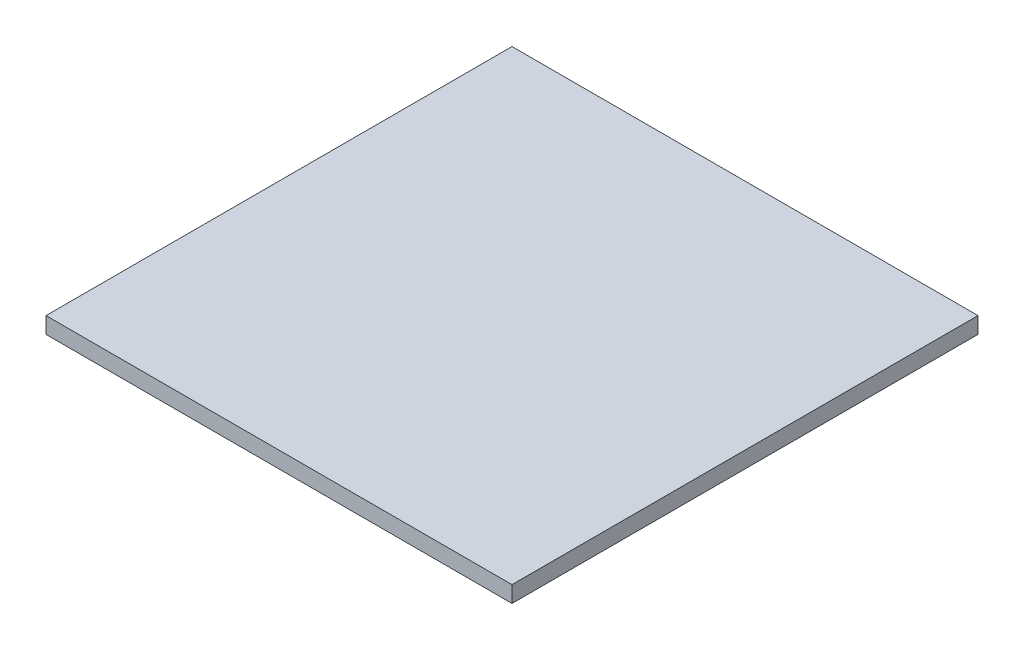
ISO-10303-21;
HEADER;
FILE_DESCRIPTION(('STEP AP214'),'2;1');
FILE_NAME('part.step','',(''),(''),'','','');
FILE_SCHEMA(('AUTOMOTIVE_DESIGN { 1 0 10303 214 1 1 1 1 }'));
ENDSEC;
DATA;
#1=APPLICATION_CONTEXT('core data for automotive mechanical design processes');
#2=APPLICATION_PROTOCOL_DEFINITION('international standard','automotive_design',2000,#1);
#3=PRODUCT_CONTEXT('',#1,'mechanical');
#4=PRODUCT('Part','Part','',(#3));
#5=PRODUCT_RELATED_PRODUCT_CATEGORY('part','',(#4));
#6=PRODUCT_DEFINITION_FORMATION('','',#4);
#7=PRODUCT_DEFINITION_CONTEXT('part definition',#1,'design');
#8=PRODUCT_DEFINITION('design','',#6,#7);
#9=PRODUCT_DEFINITION_SHAPE('','',#8);
#10=(LENGTH_UNIT() NAMED_UNIT(*) SI_UNIT(.MILLI.,.METRE.));
#11=(NAMED_UNIT(*) PLANE_ANGLE_UNIT() SI_UNIT($,.RADIAN.));
#12=(NAMED_UNIT(*) SI_UNIT($,.STERADIAN.) SOLID_ANGLE_UNIT());
#13=UNCERTAINTY_MEASURE_WITH_UNIT(LENGTH_MEASURE(1.E-05),#10,'distance_accuracy_value','');
#14=(GEOMETRIC_REPRESENTATION_CONTEXT(3) GLOBAL_UNCERTAINTY_ASSIGNED_CONTEXT((#13)) GLOBAL_UNIT_ASSIGNED_CONTEXT((#10,
#11,#12)) REPRESENTATION_CONTEXT('',''));
#15=CARTESIAN_POINT('',(0.,0.,0.));
#16=DIRECTION('',(0.,0.,1.));
#17=DIRECTION('',(1.,0.,0.));
#18=AXIS2_PLACEMENT_3D('',#15,#16,#17);
#19=CARTESIAN_POINT('',(1000.,70.,1000.));
#20=DIRECTION('',(-1.,0.,0.));
#21=DIRECTION('',(0.,0.,1.));
#22=AXIS2_PLACEMENT_3D('',#19,#20,#21);
#23=PLANE('',#22);
#24=DIRECTION('',(0.,0.,-1.));
#25=VECTOR('',#24,1.);
#26=CARTESIAN_POINT('',(1000.,0.,1000.));
#27=LINE('',#26,#25);
#28=CARTESIAN_POINT('',(1000.,0.,1000.));
#29=VERTEX_POINT('',#28);
#30=CARTESIAN_POINT('',(1000.,0.,-1000.));
#31=VERTEX_POINT('',#30);
#32=EDGE_CURVE('E80',#29,#31,#27,.T.);
#33=ORIENTED_EDGE('',*,*,#32,.T.);
#34=DIRECTION('',(0.,-1.,0.));
#35=VECTOR('',#34,1.);
#36=CARTESIAN_POINT('',(1000.,70.,-1000.));
#37=LINE('',#36,#35);
#38=CARTESIAN_POINT('',(1000.,70.,-1000.));
#39=VERTEX_POINT('',#38);
#40=EDGE_CURVE('E11',#39,#31,#37,.T.);
#41=ORIENTED_EDGE('',*,*,#40,.F.);
#42=DIRECTION('',(0.,0.,-1.));
#43=VECTOR('',#42,1.);
#44=CARTESIAN_POINT('',(1000.,70.,1000.));
#45=LINE('',#44,#43);
#46=CARTESIAN_POINT('',(1000.,70.,1000.));
#47=VERTEX_POINT('',#46);
#48=EDGE_CURVE('E68',#47,#39,#45,.T.);
#49=ORIENTED_EDGE('',*,*,#48,.F.);
#50=DIRECTION('',(0.,-1.,0.));
#51=VECTOR('',#50,1.);
#52=CARTESIAN_POINT('',(1000.,70.,1000.));
#53=LINE('',#52,#51);
#54=EDGE_CURVE('E76',#47,#29,#53,.T.);
#55=ORIENTED_EDGE('',*,*,#54,.T.);
#56=EDGE_LOOP('',(#33,#41,#49,#55));
#57=FACE_BOUND('',#56,.T.);
#58=ADVANCED_FACE('F17',(#57),#23,.F.);
#59=CARTESIAN_POINT('',(-1000.,70.,-1000.));
#60=DIRECTION('',(0.,0.,1.));
#61=DIRECTION('',(1.,0.,0.));
#62=AXIS2_PLACEMENT_3D('',#59,#60,#61);
#63=PLANE('',#62);
#64=DIRECTION('',(-1.,0.,0.));
#65=VECTOR('',#64,1.);
#66=CARTESIAN_POINT('',(-1000.,0.,-1000.));
#67=LINE('',#66,#65);
#68=CARTESIAN_POINT('',(-1000.,0.,-1000.));
#69=VERTEX_POINT('',#68);
#70=EDGE_CURVE('E72',#31,#69,#67,.T.);
#71=ORIENTED_EDGE('',*,*,#70,.T.);
#72=DIRECTION('',(0.,-1.,0.));
#73=VECTOR('',#72,1.);
#74=CARTESIAN_POINT('',(-1000.,70.,-1000.));
#75=LINE('',#74,#73);
#76=CARTESIAN_POINT('',(-1000.,70.,-1000.));
#77=VERTEX_POINT('',#76);
#78=EDGE_CURVE('E25',#77,#69,#75,.T.);
#79=ORIENTED_EDGE('',*,*,#78,.F.);
#80=DIRECTION('',(-1.,0.,0.));
#81=VECTOR('',#80,1.);
#82=CARTESIAN_POINT('',(-1000.,70.,-1000.));
#83=LINE('',#82,#81);
#84=EDGE_CURVE('E63',#39,#77,#83,.T.);
#85=ORIENTED_EDGE('',*,*,#84,.F.);
#86=ORIENTED_EDGE('',*,*,#40,.T.);
#87=EDGE_LOOP('',(#71,#79,#85,#86));
#88=FACE_BOUND('',#87,.T.);
#89=ADVANCED_FACE('F71',(#88),#63,.F.);
#90=CARTESIAN_POINT('',(-1000.,70.,1000.));
#91=DIRECTION('',(1.,0.,0.));
#92=DIRECTION('',(0.,0.,-1.));
#93=AXIS2_PLACEMENT_3D('',#90,#91,#92);
#94=PLANE('',#93);
#95=DIRECTION('',(0.,0.,1.));
#96=VECTOR('',#95,1.);
#97=CARTESIAN_POINT('',(-1000.,0.,1000.));
#98=LINE('',#97,#96);
#99=CARTESIAN_POINT('',(-1000.,0.,1000.));
#100=VERTEX_POINT('',#99);
#101=EDGE_CURVE('E50',#69,#100,#98,.T.);
#102=ORIENTED_EDGE('',*,*,#101,.T.);
#103=DIRECTION('',(0.,-1.,0.));
#104=VECTOR('',#103,1.);
#105=CARTESIAN_POINT('',(-1000.,70.,1000.));
#106=LINE('',#105,#104);
#107=CARTESIAN_POINT('',(-1000.,70.,1000.));
#108=VERTEX_POINT('',#107);
#109=EDGE_CURVE('E73',#108,#100,#106,.T.);
#110=ORIENTED_EDGE('',*,*,#109,.F.);
#111=DIRECTION('',(0.,0.,1.));
#112=VECTOR('',#111,1.);
#113=CARTESIAN_POINT('',(-1000.,70.,1000.));
#114=LINE('',#113,#112);
#115=EDGE_CURVE('E66',#77,#108,#114,.T.);
#116=ORIENTED_EDGE('',*,*,#115,.F.);
#117=ORIENTED_EDGE('',*,*,#78,.T.);
#118=EDGE_LOOP('',(#102,#110,#116,#117));
#119=FACE_BOUND('',#118,.T.);
#120=ADVANCED_FACE('F74',(#119),#94,.F.);
#121=CARTESIAN_POINT('',(-1000.,70.,1000.));
#122=DIRECTION('',(0.,0.,-1.));
#123=DIRECTION('',(-1.,0.,0.));
#124=AXIS2_PLACEMENT_3D('',#121,#122,#123);
#125=PLANE('',#124);
#126=DIRECTION('',(1.,0.,0.));
#127=VECTOR('',#126,1.);
#128=CARTESIAN_POINT('',(-1000.,0.,1000.));
#129=LINE('',#128,#127);
#130=EDGE_CURVE('E56',#100,#29,#129,.T.);
#131=ORIENTED_EDGE('',*,*,#130,.T.);
#132=ORIENTED_EDGE('',*,*,#54,.F.);
#133=DIRECTION('',(1.,0.,0.));
#134=VECTOR('',#133,1.);
#135=CARTESIAN_POINT('',(-1000.,70.,1000.));
#136=LINE('',#135,#134);
#137=EDGE_CURVE('E33',#108,#47,#136,.T.);
#138=ORIENTED_EDGE('',*,*,#137,.F.);
#139=ORIENTED_EDGE('',*,*,#109,.T.);
#140=EDGE_LOOP('',(#131,#132,#138,#139));
#141=FACE_BOUND('',#140,.T.);
#142=ADVANCED_FACE('F87',(#141),#125,.F.);
#143=CARTESIAN_POINT('',(0.,70.,0.));
#144=DIRECTION('',(0.,-1.,0.));
#145=DIRECTION('',(0.,0.,-1.));
#146=AXIS2_PLACEMENT_3D('',#143,#144,#145);
#147=PLANE('',#146);
#148=ORIENTED_EDGE('',*,*,#48,.T.);
#149=ORIENTED_EDGE('',*,*,#84,.T.);
#150=ORIENTED_EDGE('',*,*,#115,.T.);
#151=ORIENTED_EDGE('',*,*,#137,.T.);
#152=EDGE_LOOP('',(#148,#149,#150,#151));
#153=FACE_BOUND('',#152,.T.);
#154=ADVANCED_FACE('F64',(#153),#147,.F.);
#155=CARTESIAN_POINT('',(0.,0.,0.));
#156=DIRECTION('',(0.,-1.,0.));
#157=DIRECTION('',(0.,0.,-1.));
#158=AXIS2_PLACEMENT_3D('',#155,#156,#157);
#159=PLANE('',#158);
#160=ORIENTED_EDGE('',*,*,#32,.F.);
#161=ORIENTED_EDGE('',*,*,#130,.F.);
#162=ORIENTED_EDGE('',*,*,#101,.F.);
#163=ORIENTED_EDGE('',*,*,#70,.F.);
#164=EDGE_LOOP('',(#160,#161,#162,#163));
#165=FACE_BOUND('',#164,.T.);
#166=ADVANCED_FACE('F90',(#165),#159,.T.);
#167=CLOSED_SHELL('',(#58,#89,#120,#142,#154,#166));
#168=MANIFOLD_SOLID_BREP('B1',#167);
#169=ADVANCED_BREP_SHAPE_REPRESENTATION('',(#18,#168),#14);
#170=SHAPE_DEFINITION_REPRESENTATION(#9,#169);
ENDSEC;
END-ISO-10303-21;
